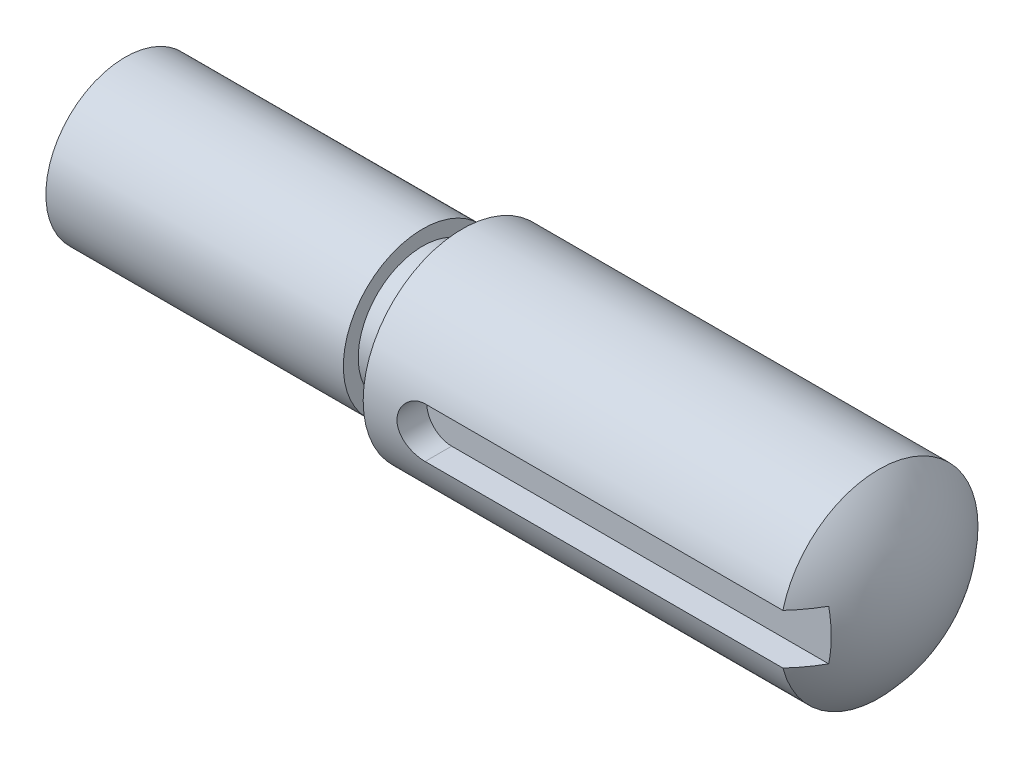
ISO-10303-21;
HEADER;
FILE_DESCRIPTION(('STEP AP214'),'2;1');
FILE_NAME('part.step','',(''),(''),'','','');
FILE_SCHEMA(('AUTOMOTIVE_DESIGN { 1 0 10303 214 1 1 1 1 }'));
ENDSEC;
DATA;
#1=APPLICATION_CONTEXT('core data for automotive mechanical design processes');
#2=APPLICATION_PROTOCOL_DEFINITION('international standard','automotive_design',2000,#1);
#3=PRODUCT_CONTEXT('',#1,'mechanical');
#4=PRODUCT('Part','Part','',(#3));
#5=PRODUCT_RELATED_PRODUCT_CATEGORY('part','',(#4));
#6=PRODUCT_DEFINITION_FORMATION('','',#4);
#7=PRODUCT_DEFINITION_CONTEXT('part definition',#1,'design');
#8=PRODUCT_DEFINITION('design','',#6,#7);
#9=PRODUCT_DEFINITION_SHAPE('','',#8);
#10=(LENGTH_UNIT() NAMED_UNIT(*) SI_UNIT(.MILLI.,.METRE.));
#11=(NAMED_UNIT(*) PLANE_ANGLE_UNIT() SI_UNIT($,.RADIAN.));
#12=(NAMED_UNIT(*) SI_UNIT($,.STERADIAN.) SOLID_ANGLE_UNIT());
#13=UNCERTAINTY_MEASURE_WITH_UNIT(LENGTH_MEASURE(1.E-05),#10,'distance_accuracy_value','');
#14=(GEOMETRIC_REPRESENTATION_CONTEXT(3) GLOBAL_UNCERTAINTY_ASSIGNED_CONTEXT((#13)) GLOBAL_UNIT_ASSIGNED_CONTEXT((#10,
#11,#12)) REPRESENTATION_CONTEXT('',''));
#15=CARTESIAN_POINT('',(0.,0.,0.));
#16=DIRECTION('',(0.,0.,1.));
#17=DIRECTION('',(1.,0.,0.));
#18=AXIS2_PLACEMENT_3D('',#15,#16,#17);
#19=CARTESIAN_POINT('',(65.5,0.,0.));
#20=DIRECTION('',(1.,0.,0.));
#21=DIRECTION('',(0.,1.,0.));
#22=AXIS2_PLACEMENT_3D('',#19,#20,#21);
#23=SPHERICAL_SURFACE('',#22,14.5);
#24=CARTESIAN_POINT('',(65.5,2.51802814953857,0.));
#25=DIRECTION('',(0.,1.,0.));
#26=DIRECTION('',(-1.,0.,0.));
#27=AXIS2_PLACEMENT_3D('',#24,#25,#26);
#28=CIRCLE('',#27,14.2796895707901);
#29=CARTESIAN_POINT('',(77.9462658752789,2.51802814953857,7.));
#30=VERTEX_POINT('',#29);
#31=CARTESIAN_POINT('',(76.,2.51802814953857,9.67778560612557));
#32=VERTEX_POINT('',#31);
#33=EDGE_CURVE('E55',#30,#32,#28,.F.);
#34=ORIENTED_EDGE('',*,*,#33,.F.);
#35=CARTESIAN_POINT('',(65.5,0.,7.));
#36=DIRECTION('',(0.,0.,-1.));
#37=DIRECTION('',(-1.,0.,0.));
#38=AXIS2_PLACEMENT_3D('',#35,#36,#37);
#39=CIRCLE('',#38,12.6984250992003);
#40=CARTESIAN_POINT('',(77.9470326157493,-2.51423528383337,7.));
#41=VERTEX_POINT('',#40);
#42=EDGE_CURVE('E11',#41,#30,#39,.F.);
#43=ORIENTED_EDGE('',*,*,#42,.F.);
#44=CARTESIAN_POINT('',(65.5,-2.51423528383337,0.));
#45=DIRECTION('',(0.,-1.,0.));
#46=DIRECTION('',(1.,0.,0.));
#47=AXIS2_PLACEMENT_3D('',#44,#45,#46);
#48=CIRCLE('',#47,14.2803578714795);
#49=CARTESIAN_POINT('',(76.,-2.51423528383337,9.67877166470659));
#50=VERTEX_POINT('',#49);
#51=EDGE_CURVE('E86',#50,#41,#48,.F.);
#52=ORIENTED_EDGE('',*,*,#51,.F.);
#53=CARTESIAN_POINT('',(76.,0.,0.));
#54=DIRECTION('',(1.,0.,0.));
#55=DIRECTION('',(0.,0.,-1.));
#56=AXIS2_PLACEMENT_3D('',#53,#54,#55);
#57=CIRCLE('',#56,9.99999999999999);
#58=EDGE_CURVE('E98',#50,#32,#57,.T.);
#59=ORIENTED_EDGE('',*,*,#58,.T.);
#60=EDGE_LOOP('',(#34,#43,#52,#59));
#61=FACE_BOUND('',#60,.T.);
#62=ADVANCED_FACE('F33',(#61),#23,.T.);
#63=CARTESIAN_POINT('',(0.,0.,0.));
#64=DIRECTION('',(-1.,0.,0.));
#65=DIRECTION('',(0.,0.,1.));
#66=AXIS2_PLACEMENT_3D('',#63,#64,#65);
#67=PLANE('',#66);
#68=CARTESIAN_POINT('',(0.,0.,0.));
#69=DIRECTION('',(1.,0.,0.));
#70=DIRECTION('',(0.,0.,-1.));
#71=AXIS2_PLACEMENT_3D('',#68,#69,#70);
#72=CIRCLE('',#71,8.);
#73=CARTESIAN_POINT('',(0.,0.,-8.));
#74=VERTEX_POINT('',#73);
#75=EDGE_CURVE('E113',#74,#74,#72,.T.);
#76=ORIENTED_EDGE('',*,*,#75,.F.);
#77=EDGE_LOOP('',(#76));
#78=FACE_BOUND('',#77,.T.);
#79=ADVANCED_FACE('F138',(#78),#67,.T.);
#80=CARTESIAN_POINT('',(80.,0.,0.));
#81=DIRECTION('',(1.,0.,0.));
#82=DIRECTION('',(0.,0.,-1.));
#83=AXIS2_PLACEMENT_3D('',#80,#81,#82);
#84=CYLINDRICAL_SURFACE('',#83,8.);
#85=ORIENTED_EDGE('',*,*,#75,.T.);
#86=EDGE_LOOP('',(#85));
#87=FACE_BOUND('',#86,.T.);
#88=CARTESIAN_POINT('',(30.,0.,0.));
#89=DIRECTION('',(1.,0.,0.));
#90=DIRECTION('',(0.,0.,-1.));
#91=AXIS2_PLACEMENT_3D('',#88,#89,#90);
#92=CIRCLE('',#91,8.);
#93=CARTESIAN_POINT('',(30.,0.,-8.));
#94=VERTEX_POINT('',#93);
#95=EDGE_CURVE('E110',#94,#94,#92,.T.);
#96=ORIENTED_EDGE('',*,*,#95,.F.);
#97=EDGE_LOOP('',(#96));
#98=FACE_BOUND('',#97,.T.);
#99=ADVANCED_FACE('F143',(#87,#98),#84,.T.);
#100=CARTESIAN_POINT('',(30.,8.,0.));
#101=DIRECTION('',(1.,0.,0.));
#102=DIRECTION('',(0.,0.,-1.));
#103=AXIS2_PLACEMENT_3D('',#100,#101,#102);
#104=PLANE('',#103);
#105=ORIENTED_EDGE('',*,*,#95,.T.);
#106=EDGE_LOOP('',(#105));
#107=FACE_BOUND('',#106,.T.);
#108=CARTESIAN_POINT('',(30.,0.,0.));
#109=DIRECTION('',(1.,0.,0.));
#110=DIRECTION('',(0.,0.,-1.));
#111=AXIS2_PLACEMENT_3D('',#108,#109,#110);
#112=CIRCLE('',#111,6.49999999999999);
#113=CARTESIAN_POINT('',(30.,0.,-6.49999999999999));
#114=VERTEX_POINT('',#113);
#115=EDGE_CURVE('E107',#114,#114,#112,.T.);
#116=ORIENTED_EDGE('',*,*,#115,.F.);
#117=EDGE_LOOP('',(#116));
#118=FACE_BOUND('',#117,.T.);
#119=ADVANCED_FACE('F158',(#107,#118),#104,.T.);
#120=CARTESIAN_POINT('',(80.,0.,0.));
#121=DIRECTION('',(1.,0.,0.));
#122=DIRECTION('',(0.,0.,-1.));
#123=AXIS2_PLACEMENT_3D('',#120,#121,#122);
#124=CYLINDRICAL_SURFACE('',#123,6.49999999999999);
#125=ORIENTED_EDGE('',*,*,#115,.T.);
#126=EDGE_LOOP('',(#125));
#127=FACE_BOUND('',#126,.T.);
#128=CARTESIAN_POINT('',(34.,0.,0.));
#129=DIRECTION('',(1.,0.,0.));
#130=DIRECTION('',(0.,0.,-1.));
#131=AXIS2_PLACEMENT_3D('',#128,#129,#130);
#132=CIRCLE('',#131,6.49999999999999);
#133=CARTESIAN_POINT('',(34.,0.,-6.49999999999999));
#134=VERTEX_POINT('',#133);
#135=EDGE_CURVE('E104',#134,#134,#132,.T.);
#136=ORIENTED_EDGE('',*,*,#135,.F.);
#137=EDGE_LOOP('',(#136));
#138=FACE_BOUND('',#137,.T.);
#139=ADVANCED_FACE('F153',(#127,#138),#124,.T.);
#140=CARTESIAN_POINT('',(34.,6.49999999999999,0.));
#141=DIRECTION('',(-1.,0.,0.));
#142=DIRECTION('',(0.,0.,1.));
#143=AXIS2_PLACEMENT_3D('',#140,#141,#142);
#144=PLANE('',#143);
#145=ORIENTED_EDGE('',*,*,#135,.T.);
#146=EDGE_LOOP('',(#145));
#147=FACE_BOUND('',#146,.T.);
#148=CARTESIAN_POINT('',(34.,0.,0.));
#149=DIRECTION('',(1.,0.,0.));
#150=DIRECTION('',(0.,0.,-1.));
#151=AXIS2_PLACEMENT_3D('',#148,#149,#150);
#152=CIRCLE('',#151,9.99999999999999);
#153=CARTESIAN_POINT('',(34.,0.,-9.99999999999999));
#154=VERTEX_POINT('',#153);
#155=EDGE_CURVE('E101',#154,#154,#152,.T.);
#156=ORIENTED_EDGE('',*,*,#155,.F.);
#157=EDGE_LOOP('',(#156));
#158=FACE_BOUND('',#157,.T.);
#159=ADVANCED_FACE('F149',(#147,#158),#144,.T.);
#160=CARTESIAN_POINT('',(80.,0.,0.));
#161=DIRECTION('',(1.,0.,0.));
#162=DIRECTION('',(0.,0.,-1.));
#163=AXIS2_PLACEMENT_3D('',#160,#161,#162);
#164=CYLINDRICAL_SURFACE('',#163,9.99999999999999);
#165=CARTESIAN_POINT('',(39.9247428847162,2.51802814953857,9.67778560612556));
#166=CARTESIAN_POINT('',(39.8551765860579,2.51803622894058,9.67777777228829));
#167=CARTESIAN_POINT('',(39.7856150919814,2.51514320712759,9.67853608537867));
#168=CARTESIAN_POINT('',(39.6470126097024,2.50361771609109,9.68152690016123));
#169=CARTESIAN_POINT('',(39.5779715350057,2.49498622287232,9.68375915116419));
#170=CARTESIAN_POINT('',(39.4410334291043,2.47206937125521,9.68963391135063));
#171=CARTESIAN_POINT('',(39.3731343915093,2.45779531887135,9.69327360013065));
#172=CARTESIAN_POINT('',(39.2388382194666,2.42372616225422,9.70184815849841));
#173=CARTESIAN_POINT('',(39.1724411062686,2.40393097995915,9.70678304639856));
#174=CARTESIAN_POINT('',(38.9762092654162,2.33648179643098,9.72332379272511));
#175=CARTESIAN_POINT('',(38.8491953019059,2.28074072624765,9.73667212485248));
#176=CARTESIAN_POINT('',(38.6063482417137,2.14941813232963,9.7664992191049));
#177=CARTESIAN_POINT('',(38.4905182267702,2.07383116127339,9.78297884036544));
#178=CARTESIAN_POINT('',(38.2706990943939,1.90315692806392,9.81762237507408));
#179=CARTESIAN_POINT('',(38.1669927725358,1.80771024940572,9.83581336045493));
#180=CARTESIAN_POINT('',(37.9768766796144,1.60079743175007,9.87159832611253));
#181=CARTESIAN_POINT('',(37.8904696802604,1.48932873060039,9.8891922103469));
#182=CARTESIAN_POINT('',(37.7362359469411,1.25158066729167,9.92210299916522));
#183=CARTESIAN_POINT('',(37.6686900893498,1.12511368432392,9.93738407402584));
#184=CARTESIAN_POINT('',(37.5559272876875,0.862178014008722,9.963637802331));
#185=CARTESIAN_POINT('',(37.5107059117304,0.725711318000513,9.97461131083073));
#186=CARTESIAN_POINT('',(37.4447833538903,0.449611371141595,9.99082444772128));
#187=CARTESIAN_POINT('',(37.4235987823474,0.310100280432622,9.99617694608621));
#188=CARTESIAN_POINT('',(37.4048340832626,0.0294052621112621,10.0009412460377));
#189=CARTESIAN_POINT('',(37.4072509392678,-0.111778449423025,10.0003538067959));
#190=CARTESIAN_POINT('',(37.4352743732659,-0.388444547485645,9.99338986872747));
#191=CARTESIAN_POINT('',(37.460357616815,-0.523983729967672,9.98714400654001));
#192=CARTESIAN_POINT('',(37.5321604766883,-0.788863164537478,9.96972030212545));
#193=CARTESIAN_POINT('',(37.5788810526126,-0.91820314141416,9.95854224115991));
#194=CARTESIAN_POINT('',(37.6930513086336,-1.16838234759359,9.93231401449881));
#195=CARTESIAN_POINT('',(37.7606857091521,-1.28913353429166,9.9172295467017));
#196=CARTESIAN_POINT('',(37.9146222100994,-1.51775226179571,9.88482570371719));
#197=CARTESIAN_POINT('',(38.0009271633672,-1.6256178297801,9.86750598714971));
#198=CARTESIAN_POINT('',(38.1925395502832,-1.82850977297492,9.83196129123538));
#199=CARTESIAN_POINT('',(38.2983012574485,-1.92310547245556,9.81372450594262));
#200=CARTESIAN_POINT('',(38.5244075809776,-2.09333755930287,9.77882982956034));
#201=CARTESIAN_POINT('',(38.6447561795365,-2.16896875202233,9.76217237184635));
#202=CARTESIAN_POINT('',(38.8974966510543,-2.29941370820143,9.73227705671929));
#203=CARTESIAN_POINT('',(39.0299513833819,-2.35411015881442,9.71905859905686));
#204=CARTESIAN_POINT('',(39.3025109171825,-2.44025445828976,9.69779150112794));
#205=CARTESIAN_POINT('',(39.4426039446385,-2.47173705954089,9.68973513530947));
#206=CARTESIAN_POINT('',(39.6407180545756,-2.4988057408012,9.68276885683576));
#207=CARTESIAN_POINT('',(39.6974051837829,-2.50459277562222,9.68127225399651));
#208=CARTESIAN_POINT('',(39.8109668349841,-2.5123032262529,9.67927408414696));
#209=CARTESIAN_POINT('',(39.867840904994,-2.51423288218539,9.67877091007268));
#210=CARTESIAN_POINT('',(39.9247428847162,-2.51423528383337,9.67877166470659));
#211=B_SPLINE_CURVE_WITH_KNOTS('',3,(#165,#166,#167,#168,#169,#170,#171,#172,#173,#174,#175,
#176,#177,#178,#179,#180,#181,#182,#183,#184,#185,#186,#187,#188,#189,#190,#191,#192,#193,#194,
#195,#196,#197,#198,#199,#200,#201,#202,#203,#204,#205,#206,#207,#208,#209,#210),.UNSPECIFIED.,
.F.,.F.,(4,2,2,2,2,2,2,2,2,2,2,2,2,2,2,2,2,2,2,2,2,2,4),(0.,0.208626350330158,0.417217226364434,
0.62539224963296,0.833570216383034,1.2495089293009,1.66556192903732,2.08992703751594,
2.51436008374611,2.94481227972354,3.37517898735304,3.79672830457699,4.21822374510111,
4.63022934806358,5.0422532249299,5.45802557610767,5.87386150174705,6.30104474405123,
6.728344870393,7.15800559037452,7.58702177175519,7.75791400217004,7.92852955395628),.UNSPECIFIED.);
#212=CARTESIAN_POINT('',(39.9247428847162,2.51802814953857,9.67778560612557));
#213=VERTEX_POINT('',#212);
#214=CARTESIAN_POINT('',(39.9247428847162,-2.51423528383337,9.67877166470659));
#215=VERTEX_POINT('',#214);
#216=EDGE_CURVE('E77',#213,#215,#211,.T.);
#217=ORIENTED_EDGE('',*,*,#216,.F.);
#218=DIRECTION('',(1.,0.,0.));
#219=VECTOR('',#218,1.);
#220=CARTESIAN_POINT('',(80.,2.51802814953857,9.67778560612557));
#221=LINE('',#220,#219);
#222=EDGE_CURVE('E40',#32,#213,#221,.F.);
#223=ORIENTED_EDGE('',*,*,#222,.F.);
#224=ORIENTED_EDGE('',*,*,#58,.F.);
#225=DIRECTION('',(1.,0.,0.));
#226=VECTOR('',#225,1.);
#227=CARTESIAN_POINT('',(80.,-2.51423528383337,9.67877166470659));
#228=LINE('',#227,#226);
#229=EDGE_CURVE('E122',#215,#50,#228,.T.);
#230=ORIENTED_EDGE('',*,*,#229,.F.);
#231=EDGE_LOOP('',(#217,#223,#224,#230));
#232=FACE_BOUND('',#231,.T.);
#233=ORIENTED_EDGE('',*,*,#155,.T.);
#234=EDGE_LOOP('',(#233));
#235=FACE_BOUND('',#234,.T.);
#236=ADVANCED_FACE('F123',(#232,#235),#164,.T.);
#237=CARTESIAN_POINT('',(39.9247428847162,0.00189643285260091,7.));
#238=DIRECTION('',(0.,0.,1.));
#239=DIRECTION('',(1.,0.,0.));
#240=AXIS2_PLACEMENT_3D('',#237,#238,#239);
#241=CYLINDRICAL_SURFACE('',#240,2.51613171668597);
#242=DIRECTION('',(0.,0.,1.));
#243=VECTOR('',#242,1.);
#244=CARTESIAN_POINT('',(39.9247428847162,2.51802814953857,7.));
#245=LINE('',#244,#243);
#246=CARTESIAN_POINT('',(39.9247428847162,2.51802814953857,7.));
#247=VERTEX_POINT('',#246);
#248=EDGE_CURVE('E79',#247,#213,#245,.T.);
#249=ORIENTED_EDGE('',*,*,#248,.T.);
#250=ORIENTED_EDGE('',*,*,#216,.T.);
#251=DIRECTION('',(0.,0.,1.));
#252=VECTOR('',#251,1.);
#253=CARTESIAN_POINT('',(39.9247428847162,-2.51423528383337,7.));
#254=LINE('',#253,#252);
#255=CARTESIAN_POINT('',(39.9247428847162,-2.51423528383337,7.));
#256=VERTEX_POINT('',#255);
#257=EDGE_CURVE('E47',#256,#215,#254,.T.);
#258=ORIENTED_EDGE('',*,*,#257,.F.);
#259=CARTESIAN_POINT('',(39.9247428847162,0.00189643285260091,7.));
#260=DIRECTION('',(0.,0.,1.));
#261=DIRECTION('',(-1.,0.,0.));
#262=AXIS2_PLACEMENT_3D('',#259,#260,#261);
#263=CIRCLE('',#262,2.51613171668597);
#264=EDGE_CURVE('E76',#247,#256,#263,.T.);
#265=ORIENTED_EDGE('',*,*,#264,.F.);
#266=EDGE_LOOP('',(#249,#250,#258,#265));
#267=FACE_BOUND('',#266,.T.);
#268=ADVANCED_FACE('F74',(#267),#241,.F.);
#269=CARTESIAN_POINT('',(39.9247428847162,2.51802814953857,7.));
#270=DIRECTION('',(0.,1.,0.));
#271=DIRECTION('',(-1.,0.,0.));
#272=AXIS2_PLACEMENT_3D('',#269,#270,#271);
#273=PLANE('',#272);
#274=ORIENTED_EDGE('',*,*,#33,.T.);
#275=ORIENTED_EDGE('',*,*,#222,.T.);
#276=ORIENTED_EDGE('',*,*,#248,.F.);
#277=DIRECTION('',(-1.,0.,0.));
#278=VECTOR('',#277,1.);
#279=CARTESIAN_POINT('',(39.9247428847162,2.51802814953857,7.));
#280=LINE('',#279,#278);
#281=EDGE_CURVE('E80',#30,#247,#280,.T.);
#282=ORIENTED_EDGE('',*,*,#281,.F.);
#283=EDGE_LOOP('',(#274,#275,#276,#282));
#284=FACE_BOUND('',#283,.T.);
#285=ADVANCED_FACE('F129',(#284),#273,.F.);
#286=CARTESIAN_POINT('',(89.3965831043269,-2.51423528383337,7.));
#287=DIRECTION('',(0.,-1.,0.));
#288=DIRECTION('',(1.,0.,0.));
#289=AXIS2_PLACEMENT_3D('',#286,#287,#288);
#290=PLANE('',#289);
#291=ORIENTED_EDGE('',*,*,#51,.T.);
#292=DIRECTION('',(1.,0.,0.));
#293=VECTOR('',#292,1.);
#294=CARTESIAN_POINT('',(89.3965831043269,-2.51423528383337,7.));
#295=LINE('',#294,#293);
#296=EDGE_CURVE('E83',#256,#41,#295,.T.);
#297=ORIENTED_EDGE('',*,*,#296,.F.);
#298=ORIENTED_EDGE('',*,*,#257,.T.);
#299=ORIENTED_EDGE('',*,*,#229,.T.);
#300=EDGE_LOOP('',(#291,#297,#298,#299));
#301=FACE_BOUND('',#300,.T.);
#302=ADVANCED_FACE('F84',(#301),#290,.F.);
#303=CARTESIAN_POINT('',(39.9247428847162,0.00189643285260091,7.));
#304=DIRECTION('',(0.,0.,-1.));
#305=DIRECTION('',(-1.,0.,0.));
#306=AXIS2_PLACEMENT_3D('',#303,#304,#305);
#307=PLANE('',#306);
#308=ORIENTED_EDGE('',*,*,#42,.T.);
#309=ORIENTED_EDGE('',*,*,#281,.T.);
#310=ORIENTED_EDGE('',*,*,#264,.T.);
#311=ORIENTED_EDGE('',*,*,#296,.T.);
#312=EDGE_LOOP('',(#308,#309,#310,#311));
#313=FACE_BOUND('',#312,.T.);
#314=ADVANCED_FACE('F90',(#313),#307,.F.);
#315=CLOSED_SHELL('',(#62,#79,#99,#119,#139,#159,#236,#268,#285,#302,#314));
#316=MANIFOLD_SOLID_BREP('B2',#315);
#317=ADVANCED_BREP_SHAPE_REPRESENTATION('',(#18,#316),#14);
#318=SHAPE_DEFINITION_REPRESENTATION(#9,#317);
ENDSEC;
END-ISO-10303-21;
